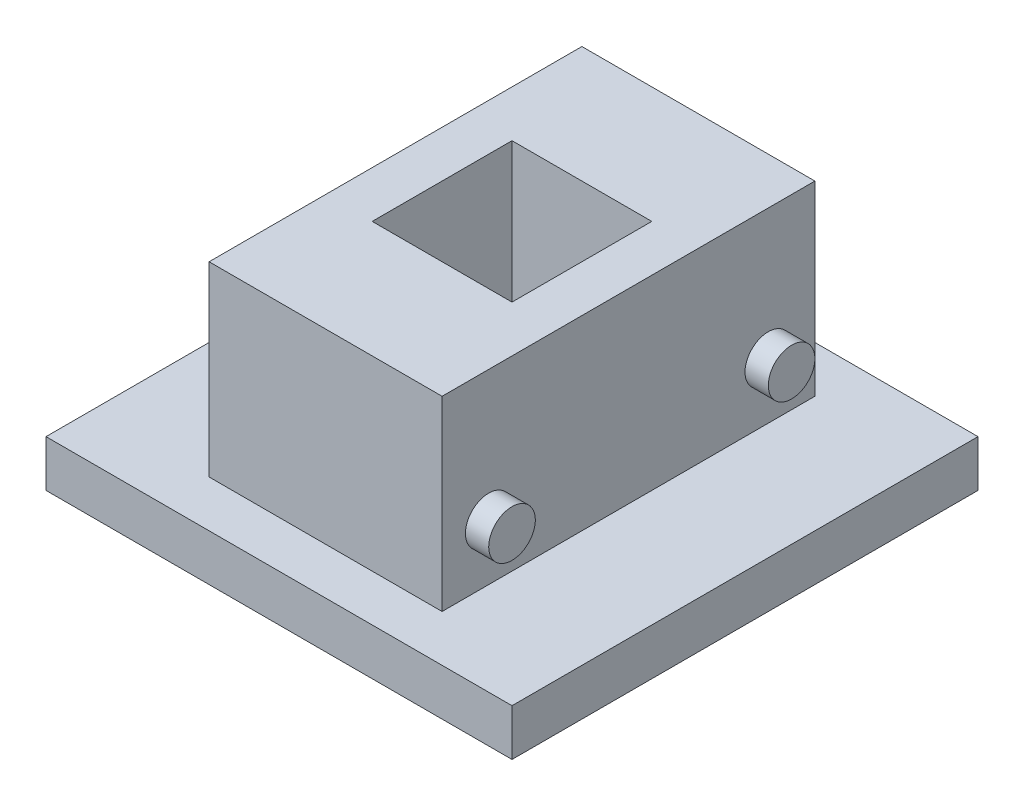
ISO-10303-21;
HEADER;
FILE_DESCRIPTION(('STEP AP214'),'2;1');
FILE_NAME('part.step','',(''),(''),'','','');
FILE_SCHEMA(('AUTOMOTIVE_DESIGN { 1 0 10303 214 1 1 1 1 }'));
ENDSEC;
DATA;
#1=APPLICATION_CONTEXT('core data for automotive mechanical design processes');
#2=APPLICATION_PROTOCOL_DEFINITION('international standard','automotive_design',2000,#1);
#3=PRODUCT_CONTEXT('',#1,'mechanical');
#4=PRODUCT('Part','Part','',(#3));
#5=PRODUCT_RELATED_PRODUCT_CATEGORY('part','',(#4));
#6=PRODUCT_DEFINITION_FORMATION('','',#4);
#7=PRODUCT_DEFINITION_CONTEXT('part definition',#1,'design');
#8=PRODUCT_DEFINITION('design','',#6,#7);
#9=PRODUCT_DEFINITION_SHAPE('','',#8);
#10=(LENGTH_UNIT() NAMED_UNIT(*) SI_UNIT(.MILLI.,.METRE.));
#11=(NAMED_UNIT(*) PLANE_ANGLE_UNIT() SI_UNIT($,.RADIAN.));
#12=(NAMED_UNIT(*) SI_UNIT($,.STERADIAN.) SOLID_ANGLE_UNIT());
#13=UNCERTAINTY_MEASURE_WITH_UNIT(LENGTH_MEASURE(1.E-05),#10,'distance_accuracy_value','');
#14=(GEOMETRIC_REPRESENTATION_CONTEXT(3) GLOBAL_UNCERTAINTY_ASSIGNED_CONTEXT((#13)) GLOBAL_UNIT_ASSIGNED_CONTEXT((#10,
#11,#12)) REPRESENTATION_CONTEXT('',''));
#15=CARTESIAN_POINT('',(0.,0.,0.));
#16=DIRECTION('',(0.,0.,1.));
#17=DIRECTION('',(1.,0.,0.));
#18=AXIS2_PLACEMENT_3D('',#15,#16,#17);
#19=CARTESIAN_POINT('',(26.8844221105528,0.,10.8040201005025));
#20=DIRECTION('',(0.,1.,0.));
#21=DIRECTION('',(0.,0.,1.));
#22=AXIS2_PLACEMENT_3D('',#19,#20,#21);
#23=CYLINDRICAL_SURFACE('',#22,8.);
#24=CARTESIAN_POINT('',(26.8844221105528,0.,10.8040201005025));
#25=DIRECTION('',(0.,1.,0.));
#26=DIRECTION('',(0.,0.,1.));
#27=AXIS2_PLACEMENT_3D('',#24,#25,#26);
#28=CIRCLE('',#27,8.);
#29=CARTESIAN_POINT('',(26.8844221105528,0.,18.8040201005025));
#30=VERTEX_POINT('',#29);
#31=EDGE_CURVE('E137',#30,#30,#28,.F.);
#32=ORIENTED_EDGE('',*,*,#31,.T.);
#33=EDGE_LOOP('',(#32));
#34=FACE_BOUND('',#33,.T.);
#35=CARTESIAN_POINT('',(26.8844221105528,9.99999999999997,10.8040201005025));
#36=DIRECTION('',(0.,1.,0.));
#37=DIRECTION('',(0.,0.,1.));
#38=AXIS2_PLACEMENT_3D('',#35,#36,#37);
#39=CIRCLE('',#38,8.);
#40=CARTESIAN_POINT('',(26.8844221105528,9.99999999999997,18.8040201005025));
#41=VERTEX_POINT('',#40);
#42=EDGE_CURVE('E134',#41,#41,#39,.F.);
#43=ORIENTED_EDGE('',*,*,#42,.F.);
#44=EDGE_LOOP('',(#43));
#45=FACE_BOUND('',#44,.T.);
#46=ADVANCED_FACE('F15',(#34,#45),#23,.F.);
#47=CARTESIAN_POINT('',(56.8844221105528,17.,-14.1959798994975));
#48=DIRECTION('',(1.,0.,0.));
#49=DIRECTION('',(0.,0.,-1.));
#50=AXIS2_PLACEMENT_3D('',#47,#48,#49);
#51=PLANE('',#50);
#52=CARTESIAN_POINT('',(56.8844221105527,22.,-19.1959798994975));
#53=DIRECTION('',(-1.,0.,0.));
#54=DIRECTION('',(0.,0.,1.));
#55=AXIS2_PLACEMENT_3D('',#52,#53,#54);
#56=CIRCLE('',#55,5.);
#57=CARTESIAN_POINT('',(56.8844221105527,22.,-14.1959798994975));
#58=VERTEX_POINT('',#57);
#59=EDGE_CURVE('E131',#58,#58,#56,.T.);
#60=ORIENTED_EDGE('',*,*,#59,.F.);
#61=EDGE_LOOP('',(#60));
#62=FACE_BOUND('',#61,.T.);
#63=ADVANCED_FACE('F352',(#62),#51,.T.);
#64=CARTESIAN_POINT('',(56.8844221105528,17.,45.8040201005025));
#65=DIRECTION('',(1.,0.,0.));
#66=DIRECTION('',(0.,0.,-1.));
#67=AXIS2_PLACEMENT_3D('',#64,#65,#66);
#68=PLANE('',#67);
#69=CARTESIAN_POINT('',(56.8844221105528,22.,40.8040201005025));
#70=DIRECTION('',(-1.,0.,0.));
#71=DIRECTION('',(0.,0.,1.));
#72=AXIS2_PLACEMENT_3D('',#69,#70,#71);
#73=CIRCLE('',#72,5.);
#74=CARTESIAN_POINT('',(56.8844221105528,22.,45.8040201005025));
#75=VERTEX_POINT('',#74);
#76=EDGE_CURVE('E118',#75,#75,#73,.T.);
#77=ORIENTED_EDGE('',*,*,#76,.F.);
#78=EDGE_LOOP('',(#77));
#79=FACE_BOUND('',#78,.T.);
#80=ADVANCED_FACE('F346',(#79),#68,.T.);
#81=CARTESIAN_POINT('',(-23.1155778894472,0.,-39.1959798994975));
#82=DIRECTION('',(0.,1.,0.));
#83=DIRECTION('',(0.,0.,1.));
#84=AXIS2_PLACEMENT_3D('',#81,#82,#83);
#85=PLANE('',#84);
#86=ORIENTED_EDGE('',*,*,#31,.F.);
#87=EDGE_LOOP('',(#86));
#88=FACE_BOUND('',#87,.T.);
#89=DIRECTION('',(1.,0.,0.));
#90=VECTOR('',#89,1.);
#91=CARTESIAN_POINT('',(26.8844221105528,0.,-39.1959798994975));
#92=LINE('',#91,#90);
#93=CARTESIAN_POINT('',(-23.1155778894472,0.,-39.1959798994975));
#94=VERTEX_POINT('',#93);
#95=CARTESIAN_POINT('',(76.8844221105528,0.,-39.1959798994975));
#96=VERTEX_POINT('',#95);
#97=EDGE_CURVE('E144',#94,#96,#92,.T.);
#98=ORIENTED_EDGE('',*,*,#97,.T.);
#99=DIRECTION('',(0.,0.,1.));
#100=VECTOR('',#99,1.);
#101=CARTESIAN_POINT('',(76.8844221105528,0.,10.8040201005025));
#102=LINE('',#101,#100);
#103=CARTESIAN_POINT('',(76.8844221105528,0.,60.8040201005025));
#104=VERTEX_POINT('',#103);
#105=EDGE_CURVE('E125',#96,#104,#102,.T.);
#106=ORIENTED_EDGE('',*,*,#105,.T.);
#107=DIRECTION('',(-1.,0.,0.));
#108=VECTOR('',#107,1.);
#109=CARTESIAN_POINT('',(26.8844221105528,0.,60.8040201005025));
#110=LINE('',#109,#108);
#111=CARTESIAN_POINT('',(-23.1155778894472,0.,60.8040201005025));
#112=VERTEX_POINT('',#111);
#113=EDGE_CURVE('E103',#104,#112,#110,.T.);
#114=ORIENTED_EDGE('',*,*,#113,.T.);
#115=DIRECTION('',(0.,0.,-1.));
#116=VECTOR('',#115,1.);
#117=CARTESIAN_POINT('',(-23.1155778894472,0.,10.8040201005025));
#118=LINE('',#117,#116);
#119=EDGE_CURVE('E109',#112,#94,#118,.T.);
#120=ORIENTED_EDGE('',*,*,#119,.T.);
#121=EDGE_LOOP('',(#98,#106,#114,#120));
#122=FACE_BOUND('',#121,.T.);
#123=ADVANCED_FACE('F124',(#88,#122),#85,.F.);
#124=CARTESIAN_POINT('',(-3.11557788944724,17.,-24.1959798994975));
#125=DIRECTION('',(-1.,0.,0.));
#126=DIRECTION('',(0.,0.,1.));
#127=AXIS2_PLACEMENT_3D('',#124,#125,#126);
#128=PLANE('',#127);
#129=CARTESIAN_POINT('',(-3.11557788944724,22.,-19.1959798994975));
#130=DIRECTION('',(1.,0.,0.));
#131=DIRECTION('',(0.,0.,-1.));
#132=AXIS2_PLACEMENT_3D('',#129,#130,#131);
#133=CIRCLE('',#132,5.);
#134=CARTESIAN_POINT('',(-3.11557788944724,22.,-24.1959798994975));
#135=VERTEX_POINT('',#134);
#136=EDGE_CURVE('E140',#135,#135,#133,.T.);
#137=ORIENTED_EDGE('',*,*,#136,.F.);
#138=EDGE_LOOP('',(#137));
#139=FACE_BOUND('',#138,.T.);
#140=ADVANCED_FACE('F321',(#139),#128,.T.);
#141=CARTESIAN_POINT('',(-3.11557788944723,17.,35.8040201005025));
#142=DIRECTION('',(-1.,0.,0.));
#143=DIRECTION('',(0.,0.,1.));
#144=AXIS2_PLACEMENT_3D('',#141,#142,#143);
#145=PLANE('',#144);
#146=CARTESIAN_POINT('',(-3.11557788944723,22.,40.8040201005025));
#147=DIRECTION('',(1.,0.,0.));
#148=DIRECTION('',(0.,0.,-1.));
#149=AXIS2_PLACEMENT_3D('',#146,#147,#148);
#150=CIRCLE('',#149,5.);
#151=CARTESIAN_POINT('',(-3.11557788944723,22.,35.8040201005025));
#152=VERTEX_POINT('',#151);
#153=EDGE_CURVE('E143',#152,#152,#150,.T.);
#154=ORIENTED_EDGE('',*,*,#153,.F.);
#155=EDGE_LOOP('',(#154));
#156=FACE_BOUND('',#155,.T.);
#157=ADVANCED_FACE('F311',(#156),#145,.T.);
#158=CARTESIAN_POINT('',(11.8844221105528,9.99999999999997,-4.19597989949751));
#159=DIRECTION('',(0.,1.,0.));
#160=DIRECTION('',(0.,0.,1.));
#161=AXIS2_PLACEMENT_3D('',#158,#159,#160);
#162=PLANE('',#161);
#163=ORIENTED_EDGE('',*,*,#42,.T.);
#164=EDGE_LOOP('',(#163));
#165=FACE_BOUND('',#164,.T.);
#166=DIRECTION('',(1.,0.,0.));
#167=VECTOR('',#166,1.);
#168=CARTESIAN_POINT('',(26.8844221105528,9.99999999999997,25.8040201005025));
#169=LINE('',#168,#167);
#170=CARTESIAN_POINT('',(11.8844221105528,9.99999999999997,25.8040201005025));
#171=VERTEX_POINT('',#170);
#172=CARTESIAN_POINT('',(41.8844221105528,9.99999999999997,25.8040201005025));
#173=VERTEX_POINT('',#172);
#174=EDGE_CURVE('E199',#171,#173,#169,.T.);
#175=ORIENTED_EDGE('',*,*,#174,.T.);
#176=DIRECTION('',(0.,0.,-1.));
#177=VECTOR('',#176,1.);
#178=CARTESIAN_POINT('',(41.8844221105528,9.99999999999997,10.8040201005025));
#179=LINE('',#178,#177);
#180=CARTESIAN_POINT('',(41.8844221105528,9.99999999999997,-4.19597989949751));
#181=VERTEX_POINT('',#180);
#182=EDGE_CURVE('E205',#173,#181,#179,.T.);
#183=ORIENTED_EDGE('',*,*,#182,.T.);
#184=DIRECTION('',(1.,0.,0.));
#185=VECTOR('',#184,1.);
#186=CARTESIAN_POINT('',(26.8844221105528,9.99999999999997,-4.19597989949751));
#187=LINE('',#186,#185);
#188=CARTESIAN_POINT('',(11.8844221105528,9.99999999999997,-4.19597989949751));
#189=VERTEX_POINT('',#188);
#190=EDGE_CURVE('E147',#189,#181,#187,.T.);
#191=ORIENTED_EDGE('',*,*,#190,.F.);
#192=DIRECTION('',(0.,0.,-1.));
#193=VECTOR('',#192,1.);
#194=CARTESIAN_POINT('',(11.8844221105528,9.99999999999997,10.8040201005025));
#195=LINE('',#194,#193);
#196=EDGE_CURVE('E188',#171,#189,#195,.T.);
#197=ORIENTED_EDGE('',*,*,#196,.F.);
#198=EDGE_LOOP('',(#175,#183,#191,#197));
#199=FACE_BOUND('',#198,.T.);
#200=ADVANCED_FACE('F304',(#165,#199),#162,.T.);
#201=CARTESIAN_POINT('',(56.8844221105528,22.,-19.1959798994975));
#202=DIRECTION('',(-1.,0.,0.));
#203=DIRECTION('',(0.,0.,1.));
#204=AXIS2_PLACEMENT_3D('',#201,#202,#203);
#205=CYLINDRICAL_SURFACE('',#204,5.);
#206=CARTESIAN_POINT('',(51.8844221105528,22.,-19.1959798994975));
#207=DIRECTION('',(-1.,0.,0.));
#208=DIRECTION('',(0.,0.,1.));
#209=AXIS2_PLACEMENT_3D('',#206,#207,#208);
#210=CIRCLE('',#209,5.);
#211=CARTESIAN_POINT('',(51.8844221105528,22.,-14.1959798994975));
#212=VERTEX_POINT('',#211);
#213=EDGE_CURVE('E154',#212,#212,#210,.T.);
#214=ORIENTED_EDGE('',*,*,#213,.F.);
#215=EDGE_LOOP('',(#214));
#216=FACE_BOUND('',#215,.T.);
#217=ORIENTED_EDGE('',*,*,#59,.T.);
#218=EDGE_LOOP('',(#217));
#219=FACE_BOUND('',#218,.T.);
#220=ADVANCED_FACE('F310',(#216,#219),#205,.T.);
#221=CARTESIAN_POINT('',(56.8844221105528,22.,40.8040201005025));
#222=DIRECTION('',(-1.,0.,0.));
#223=DIRECTION('',(0.,0.,1.));
#224=AXIS2_PLACEMENT_3D('',#221,#222,#223);
#225=CYLINDRICAL_SURFACE('',#224,5.);
#226=CARTESIAN_POINT('',(51.8844221105528,22.,40.8040201005025));
#227=DIRECTION('',(-1.,0.,0.));
#228=DIRECTION('',(0.,0.,1.));
#229=AXIS2_PLACEMENT_3D('',#226,#227,#228);
#230=CIRCLE('',#229,5.);
#231=CARTESIAN_POINT('',(51.8844221105527,22.,45.8040201005025));
#232=VERTEX_POINT('',#231);
#233=EDGE_CURVE('E150',#232,#232,#230,.T.);
#234=ORIENTED_EDGE('',*,*,#233,.F.);
#235=EDGE_LOOP('',(#234));
#236=FACE_BOUND('',#235,.T.);
#237=ORIENTED_EDGE('',*,*,#76,.T.);
#238=EDGE_LOOP('',(#237));
#239=FACE_BOUND('',#238,.T.);
#240=ADVANCED_FACE('F318',(#236,#239),#225,.T.);
#241=CARTESIAN_POINT('',(-23.1155778894472,0.,60.8040201005025));
#242=DIRECTION('',(1.,0.,0.));
#243=DIRECTION('',(0.,0.,-1.));
#244=AXIS2_PLACEMENT_3D('',#241,#242,#243);
#245=PLANE('',#244);
#246=DIRECTION('',(0.,1.,0.));
#247=VECTOR('',#246,1.);
#248=CARTESIAN_POINT('',(-23.1155778894472,5.,60.8040201005025));
#249=LINE('',#248,#247);
#250=CARTESIAN_POINT('',(-23.1155778894472,10.,60.8040201005025));
#251=VERTEX_POINT('',#250);
#252=EDGE_CURVE('E112',#112,#251,#249,.T.);
#253=ORIENTED_EDGE('',*,*,#252,.T.);
#254=DIRECTION('',(0.,0.,1.));
#255=VECTOR('',#254,1.);
#256=CARTESIAN_POINT('',(-23.1155778894472,10.,10.8040201005025));
#257=LINE('',#256,#255);
#258=CARTESIAN_POINT('',(-23.1155778894472,10.,-39.1959798994975));
#259=VERTEX_POINT('',#258);
#260=EDGE_CURVE('E153',#259,#251,#257,.T.);
#261=ORIENTED_EDGE('',*,*,#260,.F.);
#262=DIRECTION('',(0.,-1.,0.));
#263=VECTOR('',#262,1.);
#264=CARTESIAN_POINT('',(-23.1155778894472,5.,-39.1959798994975));
#265=LINE('',#264,#263);
#266=EDGE_CURVE('E114',#259,#94,#265,.T.);
#267=ORIENTED_EDGE('',*,*,#266,.T.);
#268=ORIENTED_EDGE('',*,*,#119,.F.);
#269=EDGE_LOOP('',(#253,#261,#267,#268));
#270=FACE_BOUND('',#269,.T.);
#271=ADVANCED_FACE('F110',(#270),#245,.F.);
#272=CARTESIAN_POINT('',(76.8844221105528,0.,60.8040201005025));
#273=DIRECTION('',(0.,0.,-1.));
#274=DIRECTION('',(-1.,0.,0.));
#275=AXIS2_PLACEMENT_3D('',#272,#273,#274);
#276=PLANE('',#275);
#277=DIRECTION('',(0.,1.,0.));
#278=VECTOR('',#277,1.);
#279=CARTESIAN_POINT('',(76.8844221105528,5.,60.8040201005025));
#280=LINE('',#279,#278);
#281=CARTESIAN_POINT('',(76.8844221105528,10.,60.8040201005025));
#282=VERTEX_POINT('',#281);
#283=EDGE_CURVE('E126',#104,#282,#280,.T.);
#284=ORIENTED_EDGE('',*,*,#283,.T.);
#285=DIRECTION('',(1.,0.,0.));
#286=VECTOR('',#285,1.);
#287=CARTESIAN_POINT('',(26.8844221105528,10.,60.8040201005025));
#288=LINE('',#287,#286);
#289=EDGE_CURVE('E121',#251,#282,#288,.T.);
#290=ORIENTED_EDGE('',*,*,#289,.F.);
#291=ORIENTED_EDGE('',*,*,#252,.F.);
#292=ORIENTED_EDGE('',*,*,#113,.F.);
#293=EDGE_LOOP('',(#284,#290,#291,#292));
#294=FACE_BOUND('',#293,.T.);
#295=ADVANCED_FACE('F120',(#294),#276,.F.);
#296=CARTESIAN_POINT('',(76.8844221105528,0.,-39.1959798994975));
#297=DIRECTION('',(-1.,0.,0.));
#298=DIRECTION('',(0.,0.,1.));
#299=AXIS2_PLACEMENT_3D('',#296,#297,#298);
#300=PLANE('',#299);
#301=DIRECTION('',(0.,1.,0.));
#302=VECTOR('',#301,1.);
#303=CARTESIAN_POINT('',(76.8844221105528,5.,-39.1959798994975));
#304=LINE('',#303,#302);
#305=CARTESIAN_POINT('',(76.8844221105528,10.,-39.1959798994975));
#306=VERTEX_POINT('',#305);
#307=EDGE_CURVE('E211',#96,#306,#304,.T.);
#308=ORIENTED_EDGE('',*,*,#307,.T.);
#309=DIRECTION('',(0.,0.,-1.));
#310=VECTOR('',#309,1.);
#311=CARTESIAN_POINT('',(76.8844221105528,10.,10.8040201005025));
#312=LINE('',#311,#310);
#313=EDGE_CURVE('E183',#282,#306,#312,.T.);
#314=ORIENTED_EDGE('',*,*,#313,.F.);
#315=ORIENTED_EDGE('',*,*,#283,.F.);
#316=ORIENTED_EDGE('',*,*,#105,.F.);
#317=EDGE_LOOP('',(#308,#314,#315,#316));
#318=FACE_BOUND('',#317,.T.);
#319=ADVANCED_FACE('F217',(#318),#300,.F.);
#320=CARTESIAN_POINT('',(-23.1155778894472,0.,-39.1959798994975));
#321=DIRECTION('',(0.,0.,1.));
#322=DIRECTION('',(1.,0.,0.));
#323=AXIS2_PLACEMENT_3D('',#320,#321,#322);
#324=PLANE('',#323);
#325=ORIENTED_EDGE('',*,*,#266,.F.);
#326=DIRECTION('',(-1.,0.,0.));
#327=VECTOR('',#326,1.);
#328=CARTESIAN_POINT('',(26.8844221105528,10.,-39.1959798994975));
#329=LINE('',#328,#327);
#330=EDGE_CURVE('E180',#306,#259,#329,.T.);
#331=ORIENTED_EDGE('',*,*,#330,.F.);
#332=ORIENTED_EDGE('',*,*,#307,.F.);
#333=ORIENTED_EDGE('',*,*,#97,.F.);
#334=EDGE_LOOP('',(#325,#331,#332,#333));
#335=FACE_BOUND('',#334,.T.);
#336=ADVANCED_FACE('F219',(#335),#324,.F.);
#337=CARTESIAN_POINT('',(-3.11557788944724,22.,-19.1959798994975));
#338=DIRECTION('',(1.,0.,0.));
#339=DIRECTION('',(0.,0.,-1.));
#340=AXIS2_PLACEMENT_3D('',#337,#338,#339);
#341=CYLINDRICAL_SURFACE('',#340,5.);
#342=CARTESIAN_POINT('',(1.88442211055276,22.,-19.1959798994975));
#343=DIRECTION('',(1.,0.,0.));
#344=DIRECTION('',(0.,0.,-1.));
#345=AXIS2_PLACEMENT_3D('',#342,#343,#344);
#346=CIRCLE('',#345,5.);
#347=CARTESIAN_POINT('',(1.88442211055276,22.,-24.1959798994975));
#348=VERTEX_POINT('',#347);
#349=EDGE_CURVE('E19',#348,#348,#346,.F.);
#350=ORIENTED_EDGE('',*,*,#349,.T.);
#351=EDGE_LOOP('',(#350));
#352=FACE_BOUND('',#351,.T.);
#353=ORIENTED_EDGE('',*,*,#136,.T.);
#354=EDGE_LOOP('',(#353));
#355=FACE_BOUND('',#354,.T.);
#356=ADVANCED_FACE('F283',(#352,#355),#341,.T.);
#357=CARTESIAN_POINT('',(-3.11557788944723,22.,40.8040201005025));
#358=DIRECTION('',(1.,0.,0.));
#359=DIRECTION('',(0.,0.,-1.));
#360=AXIS2_PLACEMENT_3D('',#357,#358,#359);
#361=CYLINDRICAL_SURFACE('',#360,5.);
#362=CARTESIAN_POINT('',(1.88442211055277,22.,40.8040201005025));
#363=DIRECTION('',(1.,0.,0.));
#364=DIRECTION('',(0.,0.,-1.));
#365=AXIS2_PLACEMENT_3D('',#362,#363,#364);
#366=CIRCLE('',#365,5.);
#367=CARTESIAN_POINT('',(1.88442211055277,22.,35.8040201005025));
#368=VERTEX_POINT('',#367);
#369=EDGE_CURVE('E157',#368,#368,#366,.F.);
#370=ORIENTED_EDGE('',*,*,#369,.T.);
#371=EDGE_LOOP('',(#370));
#372=FACE_BOUND('',#371,.T.);
#373=ORIENTED_EDGE('',*,*,#153,.T.);
#374=EDGE_LOOP('',(#373));
#375=FACE_BOUND('',#374,.T.);
#376=ADVANCED_FACE('F274',(#372,#375),#361,.T.);
#377=CARTESIAN_POINT('',(51.8844221105528,10.,-29.1959798994975));
#378=DIRECTION('',(0.,0.,-1.));
#379=DIRECTION('',(-1.,0.,0.));
#380=AXIS2_PLACEMENT_3D('',#377,#378,#379);
#381=PLANE('',#380);
#382=DIRECTION('',(0.,1.,0.));
#383=VECTOR('',#382,1.);
#384=CARTESIAN_POINT('',(51.8844221105528,30.,-29.1959798994975));
#385=LINE('',#384,#383);
#386=CARTESIAN_POINT('',(51.8844221105528,10.,-29.1959798994975));
#387=VERTEX_POINT('',#386);
#388=CARTESIAN_POINT('',(51.8844221105528,50.,-29.1959798994975));
#389=VERTEX_POINT('',#388);
#390=EDGE_CURVE('E156',#387,#389,#385,.T.);
#391=ORIENTED_EDGE('',*,*,#390,.F.);
#392=DIRECTION('',(1.,0.,0.));
#393=VECTOR('',#392,1.);
#394=CARTESIAN_POINT('',(26.8844221105528,10.,-29.1959798994975));
#395=LINE('',#394,#393);
#396=CARTESIAN_POINT('',(1.88442211055276,10.,-29.1959798994975));
#397=VERTEX_POINT('',#396);
#398=EDGE_CURVE('E178',#397,#387,#395,.T.);
#399=ORIENTED_EDGE('',*,*,#398,.F.);
#400=DIRECTION('',(0.,1.,0.));
#401=VECTOR('',#400,1.);
#402=CARTESIAN_POINT('',(1.88442211055276,30.,-29.1959798994975));
#403=LINE('',#402,#401);
#404=CARTESIAN_POINT('',(1.88442211055276,50.,-29.1959798994975));
#405=VERTEX_POINT('',#404);
#406=EDGE_CURVE('E164',#397,#405,#403,.T.);
#407=ORIENTED_EDGE('',*,*,#406,.T.);
#408=DIRECTION('',(-1.,0.,0.));
#409=VECTOR('',#408,1.);
#410=CARTESIAN_POINT('',(26.8844221105528,50.,-29.1959798994975));
#411=LINE('',#410,#409);
#412=EDGE_CURVE('E266',#389,#405,#411,.T.);
#413=ORIENTED_EDGE('',*,*,#412,.F.);
#414=EDGE_LOOP('',(#391,#399,#407,#413));
#415=FACE_BOUND('',#414,.T.);
#416=ADVANCED_FACE('F271',(#415),#381,.T.);
#417=CARTESIAN_POINT('',(11.8844221105528,9.99999999999997,-4.19597989949751));
#418=DIRECTION('',(0.,0.,1.));
#419=DIRECTION('',(1.,0.,0.));
#420=AXIS2_PLACEMENT_3D('',#417,#418,#419);
#421=PLANE('',#420);
#422=DIRECTION('',(0.,1.,0.));
#423=VECTOR('',#422,1.);
#424=CARTESIAN_POINT('',(11.8844221105528,30.,-4.19597989949751));
#425=LINE('',#424,#423);
#426=CARTESIAN_POINT('',(11.8844221105528,50.,-4.19597989949751));
#427=VERTEX_POINT('',#426);
#428=EDGE_CURVE('E194',#189,#427,#425,.T.);
#429=ORIENTED_EDGE('',*,*,#428,.F.);
#430=ORIENTED_EDGE('',*,*,#190,.T.);
#431=DIRECTION('',(0.,1.,0.));
#432=VECTOR('',#431,1.);
#433=CARTESIAN_POINT('',(41.8844221105528,30.,-4.19597989949751));
#434=LINE('',#433,#432);
#435=CARTESIAN_POINT('',(41.8844221105528,50.,-4.19597989949751));
#436=VERTEX_POINT('',#435);
#437=EDGE_CURVE('E202',#181,#436,#434,.T.);
#438=ORIENTED_EDGE('',*,*,#437,.T.);
#439=DIRECTION('',(1.,0.,0.));
#440=VECTOR('',#439,1.);
#441=CARTESIAN_POINT('',(26.8844221105528,50.,-4.19597989949751));
#442=LINE('',#441,#440);
#443=EDGE_CURVE('E264',#427,#436,#442,.T.);
#444=ORIENTED_EDGE('',*,*,#443,.F.);
#445=EDGE_LOOP('',(#429,#430,#438,#444));
#446=FACE_BOUND('',#445,.T.);
#447=ADVANCED_FACE('F273',(#446),#421,.T.);
#448=CARTESIAN_POINT('',(41.8844221105528,9.99999999999997,25.8040201005025));
#449=DIRECTION('',(1.,0.,0.));
#450=DIRECTION('',(0.,0.,-1.));
#451=AXIS2_PLACEMENT_3D('',#448,#449,#450);
#452=PLANE('',#451);
#453=ORIENTED_EDGE('',*,*,#437,.F.);
#454=ORIENTED_EDGE('',*,*,#182,.F.);
#455=DIRECTION('',(0.,1.,0.));
#456=VECTOR('',#455,1.);
#457=CARTESIAN_POINT('',(41.8844221105528,30.,25.8040201005025));
#458=LINE('',#457,#456);
#459=CARTESIAN_POINT('',(41.8844221105528,50.,25.8040201005025));
#460=VERTEX_POINT('',#459);
#461=EDGE_CURVE('E196',#173,#460,#458,.T.);
#462=ORIENTED_EDGE('',*,*,#461,.T.);
#463=DIRECTION('',(0.,0.,1.));
#464=VECTOR('',#463,1.);
#465=CARTESIAN_POINT('',(41.8844221105528,50.,10.8040201005025));
#466=LINE('',#465,#464);
#467=EDGE_CURVE('E262',#436,#460,#466,.T.);
#468=ORIENTED_EDGE('',*,*,#467,.F.);
#469=EDGE_LOOP('',(#453,#454,#462,#468));
#470=FACE_BOUND('',#469,.T.);
#471=ADVANCED_FACE('F280',(#470),#452,.F.);
#472=CARTESIAN_POINT('',(11.8844221105528,9.99999999999997,25.8040201005025));
#473=DIRECTION('',(0.,0.,1.));
#474=DIRECTION('',(1.,0.,0.));
#475=AXIS2_PLACEMENT_3D('',#472,#473,#474);
#476=PLANE('',#475);
#477=ORIENTED_EDGE('',*,*,#461,.F.);
#478=ORIENTED_EDGE('',*,*,#174,.F.);
#479=DIRECTION('',(0.,-1.,0.));
#480=VECTOR('',#479,1.);
#481=CARTESIAN_POINT('',(11.8844221105528,30.,25.8040201005025));
#482=LINE('',#481,#480);
#483=CARTESIAN_POINT('',(11.8844221105528,50.,25.8040201005025));
#484=VERTEX_POINT('',#483);
#485=EDGE_CURVE('E191',#484,#171,#482,.T.);
#486=ORIENTED_EDGE('',*,*,#485,.F.);
#487=DIRECTION('',(-1.,0.,0.));
#488=VECTOR('',#487,1.);
#489=CARTESIAN_POINT('',(26.8844221105528,50.,25.8040201005025));
#490=LINE('',#489,#488);
#491=EDGE_CURVE('E260',#460,#484,#490,.T.);
#492=ORIENTED_EDGE('',*,*,#491,.F.);
#493=EDGE_LOOP('',(#477,#478,#486,#492));
#494=FACE_BOUND('',#493,.T.);
#495=ADVANCED_FACE('F289',(#494),#476,.F.);
#496=CARTESIAN_POINT('',(11.8844221105528,9.99999999999997,25.8040201005025));
#497=DIRECTION('',(1.,0.,0.));
#498=DIRECTION('',(0.,0.,-1.));
#499=AXIS2_PLACEMENT_3D('',#496,#497,#498);
#500=PLANE('',#499);
#501=ORIENTED_EDGE('',*,*,#485,.T.);
#502=ORIENTED_EDGE('',*,*,#196,.T.);
#503=ORIENTED_EDGE('',*,*,#428,.T.);
#504=DIRECTION('',(0.,0.,-1.));
#505=VECTOR('',#504,1.);
#506=CARTESIAN_POINT('',(11.8844221105528,50.,10.8040201005025));
#507=LINE('',#506,#505);
#508=EDGE_CURVE('E255',#484,#427,#507,.T.);
#509=ORIENTED_EDGE('',*,*,#508,.F.);
#510=EDGE_LOOP('',(#501,#502,#503,#509));
#511=FACE_BOUND('',#510,.T.);
#512=ADVANCED_FACE('F235',(#511),#500,.T.);
#513=CARTESIAN_POINT('',(51.8844221105528,10.,50.8040201005025));
#514=DIRECTION('',(1.,0.,0.));
#515=DIRECTION('',(0.,0.,-1.));
#516=AXIS2_PLACEMENT_3D('',#513,#514,#515);
#517=PLANE('',#516);
#518=ORIENTED_EDGE('',*,*,#233,.T.);
#519=EDGE_LOOP('',(#518));
#520=FACE_BOUND('',#519,.T.);
#521=ORIENTED_EDGE('',*,*,#213,.T.);
#522=EDGE_LOOP('',(#521));
#523=FACE_BOUND('',#522,.T.);
#524=DIRECTION('',(0.,-1.,0.));
#525=VECTOR('',#524,1.);
#526=CARTESIAN_POINT('',(51.8844221105528,30.,50.8040201005025));
#527=LINE('',#526,#525);
#528=CARTESIAN_POINT('',(51.8844221105528,50.,50.8040201005025));
#529=VERTEX_POINT('',#528);
#530=CARTESIAN_POINT('',(51.8844221105528,10.,50.8040201005025));
#531=VERTEX_POINT('',#530);
#532=EDGE_CURVE('E253',#529,#531,#527,.T.);
#533=ORIENTED_EDGE('',*,*,#532,.T.);
#534=DIRECTION('',(0.,0.,1.));
#535=VECTOR('',#534,1.);
#536=CARTESIAN_POINT('',(51.8844221105528,10.,10.8040201005025));
#537=LINE('',#536,#535);
#538=EDGE_CURVE('E173',#387,#531,#537,.T.);
#539=ORIENTED_EDGE('',*,*,#538,.F.);
#540=ORIENTED_EDGE('',*,*,#390,.T.);
#541=DIRECTION('',(0.,0.,-1.));
#542=VECTOR('',#541,1.);
#543=CARTESIAN_POINT('',(51.8844221105528,50.,10.8040201005025));
#544=LINE('',#543,#542);
#545=EDGE_CURVE('E161',#529,#389,#544,.T.);
#546=ORIENTED_EDGE('',*,*,#545,.F.);
#547=EDGE_LOOP('',(#533,#539,#540,#546));
#548=FACE_BOUND('',#547,.T.);
#549=ADVANCED_FACE('F224',(#520,#523,#548),#517,.T.);
#550=CARTESIAN_POINT('',(-23.1155778894472,10.,-39.1959798994975));
#551=DIRECTION('',(0.,1.,0.));
#552=DIRECTION('',(0.,0.,1.));
#553=AXIS2_PLACEMENT_3D('',#550,#551,#552);
#554=PLANE('',#553);
#555=ORIENTED_EDGE('',*,*,#398,.T.);
#556=ORIENTED_EDGE('',*,*,#538,.T.);
#557=DIRECTION('',(-1.,0.,0.));
#558=VECTOR('',#557,1.);
#559=CARTESIAN_POINT('',(26.8844221105528,10.,50.8040201005025));
#560=LINE('',#559,#558);
#561=CARTESIAN_POINT('',(1.88442211055277,10.,50.8040201005025));
#562=VERTEX_POINT('',#561);
#563=EDGE_CURVE('E248',#531,#562,#560,.T.);
#564=ORIENTED_EDGE('',*,*,#563,.T.);
#565=DIRECTION('',(0.,0.,-1.));
#566=VECTOR('',#565,1.);
#567=CARTESIAN_POINT('',(1.88442211055276,10.,10.8040201005025));
#568=LINE('',#567,#566);
#569=EDGE_CURVE('E167',#562,#397,#568,.T.);
#570=ORIENTED_EDGE('',*,*,#569,.T.);
#571=EDGE_LOOP('',(#555,#556,#564,#570));
#572=FACE_BOUND('',#571,.T.);
#573=ORIENTED_EDGE('',*,*,#313,.T.);
#574=ORIENTED_EDGE('',*,*,#330,.T.);
#575=ORIENTED_EDGE('',*,*,#260,.T.);
#576=ORIENTED_EDGE('',*,*,#289,.T.);
#577=EDGE_LOOP('',(#573,#574,#575,#576));
#578=FACE_BOUND('',#577,.T.);
#579=ADVANCED_FACE('F221',(#572,#578),#554,.T.);
#580=CARTESIAN_POINT('',(1.88442211055277,10.,50.8040201005025));
#581=DIRECTION('',(1.,0.,0.));
#582=DIRECTION('',(0.,0.,-1.));
#583=AXIS2_PLACEMENT_3D('',#580,#581,#582);
#584=PLANE('',#583);
#585=ORIENTED_EDGE('',*,*,#369,.F.);
#586=EDGE_LOOP('',(#585));
#587=FACE_BOUND('',#586,.T.);
#588=ORIENTED_EDGE('',*,*,#349,.F.);
#589=EDGE_LOOP('',(#588));
#590=FACE_BOUND('',#589,.T.);
#591=ORIENTED_EDGE('',*,*,#406,.F.);
#592=ORIENTED_EDGE('',*,*,#569,.F.);
#593=DIRECTION('',(0.,1.,0.));
#594=VECTOR('',#593,1.);
#595=CARTESIAN_POINT('',(1.88442211055277,30.,50.8040201005025));
#596=LINE('',#595,#594);
#597=CARTESIAN_POINT('',(1.88442211055277,50.,50.8040201005025));
#598=VERTEX_POINT('',#597);
#599=EDGE_CURVE('E25',#562,#598,#596,.T.);
#600=ORIENTED_EDGE('',*,*,#599,.T.);
#601=DIRECTION('',(0.,0.,1.));
#602=VECTOR('',#601,1.);
#603=CARTESIAN_POINT('',(1.88442211055276,50.,10.8040201005025));
#604=LINE('',#603,#602);
#605=EDGE_CURVE('E33',#405,#598,#604,.T.);
#606=ORIENTED_EDGE('',*,*,#605,.F.);
#607=EDGE_LOOP('',(#591,#592,#600,#606));
#608=FACE_BOUND('',#607,.T.);
#609=ADVANCED_FACE('F223',(#587,#590,#608),#584,.F.);
#610=CARTESIAN_POINT('',(1.88442211055276,50.,-29.1959798994975));
#611=DIRECTION('',(0.,1.,0.));
#612=DIRECTION('',(0.,0.,1.));
#613=AXIS2_PLACEMENT_3D('',#610,#611,#612);
#614=PLANE('',#613);
#615=ORIENTED_EDGE('',*,*,#491,.T.);
#616=ORIENTED_EDGE('',*,*,#508,.T.);
#617=ORIENTED_EDGE('',*,*,#443,.T.);
#618=ORIENTED_EDGE('',*,*,#467,.T.);
#619=EDGE_LOOP('',(#615,#616,#617,#618));
#620=FACE_BOUND('',#619,.T.);
#621=ORIENTED_EDGE('',*,*,#545,.T.);
#622=ORIENTED_EDGE('',*,*,#412,.T.);
#623=ORIENTED_EDGE('',*,*,#605,.T.);
#624=DIRECTION('',(1.,0.,0.));
#625=VECTOR('',#624,1.);
#626=CARTESIAN_POINT('',(26.8844221105528,50.,50.8040201005025));
#627=LINE('',#626,#625);
#628=EDGE_CURVE('E10',#598,#529,#627,.T.);
#629=ORIENTED_EDGE('',*,*,#628,.T.);
#630=EDGE_LOOP('',(#621,#622,#623,#629));
#631=FACE_BOUND('',#630,.T.);
#632=ADVANCED_FACE('F232',(#620,#631),#614,.T.);
#633=CARTESIAN_POINT('',(51.8844221105528,10.,50.8040201005025));
#634=DIRECTION('',(0.,0.,-1.));
#635=DIRECTION('',(-1.,0.,0.));
#636=AXIS2_PLACEMENT_3D('',#633,#634,#635);
#637=PLANE('',#636);
#638=ORIENTED_EDGE('',*,*,#599,.F.);
#639=ORIENTED_EDGE('',*,*,#563,.F.);
#640=ORIENTED_EDGE('',*,*,#532,.F.);
#641=ORIENTED_EDGE('',*,*,#628,.F.);
#642=EDGE_LOOP('',(#638,#639,#640,#641));
#643=FACE_BOUND('',#642,.T.);
#644=ADVANCED_FACE('F17',(#643),#637,.F.);
#645=CLOSED_SHELL('',(#46,#63,#80,#123,#140,#157,#200,#220,#240,#271,#295,#319,#336,#356,#376,
#416,#447,#471,#495,#512,#549,#579,#609,#632,#644));
#646=MANIFOLD_SOLID_BREP('B1',#645);
#647=ADVANCED_BREP_SHAPE_REPRESENTATION('',(#18,#646),#14);
#648=SHAPE_DEFINITION_REPRESENTATION(#9,#647);
ENDSEC;
END-ISO-10303-21;
